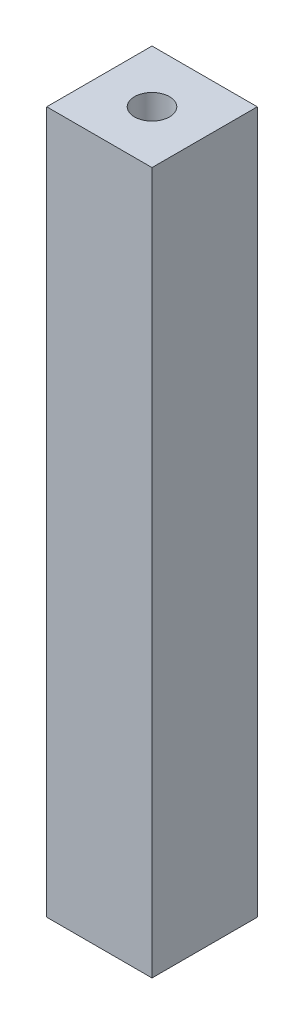
ISO-10303-21;
HEADER;
FILE_DESCRIPTION(('STEP AP214'),'2;1');
FILE_NAME('part.step','',(''),(''),'','','');
FILE_SCHEMA(('AUTOMOTIVE_DESIGN { 1 0 10303 214 1 1 1 1 }'));
ENDSEC;
DATA;
#1=APPLICATION_CONTEXT('core data for automotive mechanical design processes');
#2=APPLICATION_PROTOCOL_DEFINITION('international standard','automotive_design',2000,#1);
#3=PRODUCT_CONTEXT('',#1,'mechanical');
#4=PRODUCT('Part','Part','',(#3));
#5=PRODUCT_RELATED_PRODUCT_CATEGORY('part','',(#4));
#6=PRODUCT_DEFINITION_FORMATION('','',#4);
#7=PRODUCT_DEFINITION_CONTEXT('part definition',#1,'design');
#8=PRODUCT_DEFINITION('design','',#6,#7);
#9=PRODUCT_DEFINITION_SHAPE('','',#8);
#10=(LENGTH_UNIT() NAMED_UNIT(*) SI_UNIT(.MILLI.,.METRE.));
#11=(NAMED_UNIT(*) PLANE_ANGLE_UNIT() SI_UNIT($,.RADIAN.));
#12=(NAMED_UNIT(*) SI_UNIT($,.STERADIAN.) SOLID_ANGLE_UNIT());
#13=UNCERTAINTY_MEASURE_WITH_UNIT(LENGTH_MEASURE(1.E-05),#10,'distance_accuracy_value','');
#14=(GEOMETRIC_REPRESENTATION_CONTEXT(3) GLOBAL_UNCERTAINTY_ASSIGNED_CONTEXT((#13)) GLOBAL_UNIT_ASSIGNED_CONTEXT((#10,
#11,#12)) REPRESENTATION_CONTEXT('',''));
#15=CARTESIAN_POINT('',(0.,0.,0.));
#16=DIRECTION('',(0.,0.,1.));
#17=DIRECTION('',(1.,0.,0.));
#18=AXIS2_PLACEMENT_3D('',#15,#16,#17);
#19=CARTESIAN_POINT('',(0.,100.,0.));
#20=DIRECTION('',(0.,1.,0.));
#21=DIRECTION('',(0.,0.,1.));
#22=AXIS2_PLACEMENT_3D('',#19,#20,#21);
#23=PLANE('',#22);
#24=DIRECTION('',(0.,0.,1.));
#25=VECTOR('',#24,1.);
#26=CARTESIAN_POINT('',(-7.5,100.,7.5));
#27=LINE('',#26,#25);
#28=CARTESIAN_POINT('',(-7.5,100.,-7.5));
#29=VERTEX_POINT('',#28);
#30=CARTESIAN_POINT('',(-7.5,100.,7.5));
#31=VERTEX_POINT('',#30);
#32=EDGE_CURVE('E85',#29,#31,#27,.T.);
#33=ORIENTED_EDGE('',*,*,#32,.T.);
#34=DIRECTION('',(1.,0.,0.));
#35=VECTOR('',#34,1.);
#36=CARTESIAN_POINT('',(7.5,100.,7.5));
#37=LINE('',#36,#35);
#38=CARTESIAN_POINT('',(7.5,100.,7.5));
#39=VERTEX_POINT('',#38);
#40=EDGE_CURVE('E80',#31,#39,#37,.T.);
#41=ORIENTED_EDGE('',*,*,#40,.T.);
#42=DIRECTION('',(0.,0.,-1.));
#43=VECTOR('',#42,1.);
#44=CARTESIAN_POINT('',(7.5,100.,7.5));
#45=LINE('',#44,#43);
#46=CARTESIAN_POINT('',(7.5,100.,-7.5));
#47=VERTEX_POINT('',#46);
#48=EDGE_CURVE('E83',#39,#47,#45,.T.);
#49=ORIENTED_EDGE('',*,*,#48,.T.);
#50=DIRECTION('',(-1.,0.,0.));
#51=VECTOR('',#50,1.);
#52=CARTESIAN_POINT('',(7.5,100.,-7.5));
#53=LINE('',#52,#51);
#54=EDGE_CURVE('E50',#47,#29,#53,.T.);
#55=ORIENTED_EDGE('',*,*,#54,.T.);
#56=EDGE_LOOP('',(#33,#41,#49,#55));
#57=FACE_BOUND('',#56,.T.);
#58=CARTESIAN_POINT('',(0.,100.,0.));
#59=DIRECTION('',(0.,1.,0.));
#60=DIRECTION('',(0.,0.,1.));
#61=AXIS2_PLACEMENT_3D('',#58,#59,#60);
#62=CIRCLE('',#61,2.5);
#63=CARTESIAN_POINT('',(0.,100.,2.5));
#64=VERTEX_POINT('',#63);
#65=EDGE_CURVE('E100',#64,#64,#62,.T.);
#66=ORIENTED_EDGE('',*,*,#65,.F.);
#67=EDGE_LOOP('',(#66));
#68=FACE_BOUND('',#67,.T.);
#69=ADVANCED_FACE('F33',(#57,#68),#23,.T.);
#70=CARTESIAN_POINT('',(0.,0.,0.));
#71=DIRECTION('',(0.,1.,0.));
#72=DIRECTION('',(0.,0.,1.));
#73=AXIS2_PLACEMENT_3D('',#70,#71,#72);
#74=PLANE('',#73);
#75=DIRECTION('',(0.,0.,1.));
#76=VECTOR('',#75,1.);
#77=CARTESIAN_POINT('',(-7.5,0.,7.5));
#78=LINE('',#77,#76);
#79=CARTESIAN_POINT('',(-7.5,0.,-7.5));
#80=VERTEX_POINT('',#79);
#81=CARTESIAN_POINT('',(-7.5,0.,7.5));
#82=VERTEX_POINT('',#81);
#83=EDGE_CURVE('E97',#80,#82,#78,.T.);
#84=ORIENTED_EDGE('',*,*,#83,.F.);
#85=DIRECTION('',(-1.,0.,0.));
#86=VECTOR('',#85,1.);
#87=CARTESIAN_POINT('',(7.5,0.,-7.5));
#88=LINE('',#87,#86);
#89=CARTESIAN_POINT('',(7.5,0.,-7.5));
#90=VERTEX_POINT('',#89);
#91=EDGE_CURVE('E73',#90,#80,#88,.T.);
#92=ORIENTED_EDGE('',*,*,#91,.F.);
#93=DIRECTION('',(0.,0.,-1.));
#94=VECTOR('',#93,1.);
#95=CARTESIAN_POINT('',(7.5,0.,7.5));
#96=LINE('',#95,#94);
#97=CARTESIAN_POINT('',(7.5,0.,7.5));
#98=VERTEX_POINT('',#97);
#99=EDGE_CURVE('E67',#98,#90,#96,.T.);
#100=ORIENTED_EDGE('',*,*,#99,.F.);
#101=DIRECTION('',(1.,0.,0.));
#102=VECTOR('',#101,1.);
#103=CARTESIAN_POINT('',(7.5,0.,7.5));
#104=LINE('',#103,#102);
#105=EDGE_CURVE('E89',#82,#98,#104,.T.);
#106=ORIENTED_EDGE('',*,*,#105,.F.);
#107=EDGE_LOOP('',(#84,#92,#100,#106));
#108=FACE_BOUND('',#107,.T.);
#109=CARTESIAN_POINT('',(0.,0.,0.));
#110=DIRECTION('',(0.,1.,0.));
#111=DIRECTION('',(0.,0.,1.));
#112=AXIS2_PLACEMENT_3D('',#109,#110,#111);
#113=CIRCLE('',#112,2.5);
#114=CARTESIAN_POINT('',(0.,0.,2.5));
#115=VERTEX_POINT('',#114);
#116=EDGE_CURVE('E112',#115,#115,#113,.T.);
#117=ORIENTED_EDGE('',*,*,#116,.T.);
#118=EDGE_LOOP('',(#117));
#119=FACE_BOUND('',#118,.T.);
#120=ADVANCED_FACE('F108',(#108,#119),#74,.F.);
#121=CARTESIAN_POINT('',(-7.5,100.,7.5));
#122=DIRECTION('',(1.,0.,0.));
#123=DIRECTION('',(0.,0.,-1.));
#124=AXIS2_PLACEMENT_3D('',#121,#122,#123);
#125=PLANE('',#124);
#126=ORIENTED_EDGE('',*,*,#83,.T.);
#127=DIRECTION('',(0.,-1.,0.));
#128=VECTOR('',#127,1.);
#129=CARTESIAN_POINT('',(-7.5,100.,7.5));
#130=LINE('',#129,#128);
#131=EDGE_CURVE('E11',#31,#82,#130,.T.);
#132=ORIENTED_EDGE('',*,*,#131,.F.);
#133=ORIENTED_EDGE('',*,*,#32,.F.);
#134=DIRECTION('',(0.,-1.,0.));
#135=VECTOR('',#134,1.);
#136=CARTESIAN_POINT('',(-7.5,100.,-7.5));
#137=LINE('',#136,#135);
#138=EDGE_CURVE('E93',#29,#80,#137,.T.);
#139=ORIENTED_EDGE('',*,*,#138,.T.);
#140=EDGE_LOOP('',(#126,#132,#133,#139));
#141=FACE_BOUND('',#140,.T.);
#142=ADVANCED_FACE('F35',(#141),#125,.F.);
#143=CARTESIAN_POINT('',(7.5,100.,7.5));
#144=DIRECTION('',(0.,0.,-1.));
#145=DIRECTION('',(-1.,0.,0.));
#146=AXIS2_PLACEMENT_3D('',#143,#144,#145);
#147=PLANE('',#146);
#148=ORIENTED_EDGE('',*,*,#105,.T.);
#149=DIRECTION('',(0.,-1.,0.));
#150=VECTOR('',#149,1.);
#151=CARTESIAN_POINT('',(7.5,100.,7.5));
#152=LINE('',#151,#150);
#153=EDGE_CURVE('E42',#39,#98,#152,.T.);
#154=ORIENTED_EDGE('',*,*,#153,.F.);
#155=ORIENTED_EDGE('',*,*,#40,.F.);
#156=ORIENTED_EDGE('',*,*,#131,.T.);
#157=EDGE_LOOP('',(#148,#154,#155,#156));
#158=FACE_BOUND('',#157,.T.);
#159=ADVANCED_FACE('F88',(#158),#147,.F.);
#160=CARTESIAN_POINT('',(7.5,100.,7.5));
#161=DIRECTION('',(-1.,0.,0.));
#162=DIRECTION('',(0.,0.,1.));
#163=AXIS2_PLACEMENT_3D('',#160,#161,#162);
#164=PLANE('',#163);
#165=ORIENTED_EDGE('',*,*,#99,.T.);
#166=DIRECTION('',(0.,-1.,0.));
#167=VECTOR('',#166,1.);
#168=CARTESIAN_POINT('',(7.5,100.,-7.5));
#169=LINE('',#168,#167);
#170=EDGE_CURVE('E90',#47,#90,#169,.T.);
#171=ORIENTED_EDGE('',*,*,#170,.F.);
#172=ORIENTED_EDGE('',*,*,#48,.F.);
#173=ORIENTED_EDGE('',*,*,#153,.T.);
#174=EDGE_LOOP('',(#165,#171,#172,#173));
#175=FACE_BOUND('',#174,.T.);
#176=ADVANCED_FACE('F91',(#175),#164,.F.);
#177=CARTESIAN_POINT('',(7.5,100.,-7.5));
#178=DIRECTION('',(0.,0.,1.));
#179=DIRECTION('',(1.,0.,0.));
#180=AXIS2_PLACEMENT_3D('',#177,#178,#179);
#181=PLANE('',#180);
#182=ORIENTED_EDGE('',*,*,#91,.T.);
#183=ORIENTED_EDGE('',*,*,#138,.F.);
#184=ORIENTED_EDGE('',*,*,#54,.F.);
#185=ORIENTED_EDGE('',*,*,#170,.T.);
#186=EDGE_LOOP('',(#182,#183,#184,#185));
#187=FACE_BOUND('',#186,.T.);
#188=ADVANCED_FACE('F105',(#187),#181,.F.);
#189=CARTESIAN_POINT('',(0.,100.,0.));
#190=DIRECTION('',(0.,-1.,0.));
#191=DIRECTION('',(0.,0.,-1.));
#192=AXIS2_PLACEMENT_3D('',#189,#190,#191);
#193=CYLINDRICAL_SURFACE('',#192,2.5);
#194=ORIENTED_EDGE('',*,*,#65,.T.);
#195=EDGE_LOOP('',(#194));
#196=FACE_BOUND('',#195,.T.);
#197=ORIENTED_EDGE('',*,*,#116,.F.);
#198=EDGE_LOOP('',(#197));
#199=FACE_BOUND('',#198,.T.);
#200=ADVANCED_FACE('F118',(#196,#199),#193,.F.);
#201=CLOSED_SHELL('',(#69,#120,#142,#159,#176,#188,#200));
#202=MANIFOLD_SOLID_BREP('B2',#201);
#203=ADVANCED_BREP_SHAPE_REPRESENTATION('',(#18,#202),#14);
#204=SHAPE_DEFINITION_REPRESENTATION(#9,#203);
ENDSEC;
END-ISO-10303-21;
